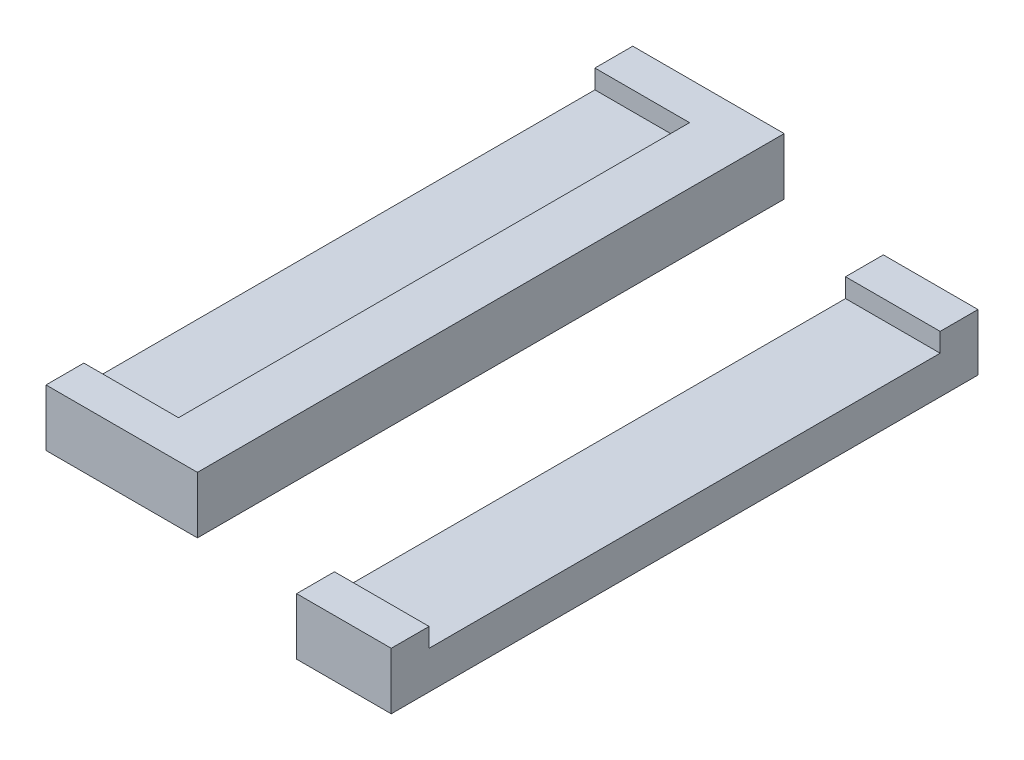
ISO-10303-21;
HEADER;
FILE_DESCRIPTION(('STEP AP214'),'2;1');
FILE_NAME('part.step','',(''),(''),'','','');
FILE_SCHEMA(('AUTOMOTIVE_DESIGN { 1 0 10303 214 1 1 1 1 }'));
ENDSEC;
DATA;
#1=APPLICATION_CONTEXT('core data for automotive mechanical design processes');
#2=APPLICATION_PROTOCOL_DEFINITION('international standard','automotive_design',2000,#1);
#3=PRODUCT_CONTEXT('',#1,'mechanical');
#4=PRODUCT('Part','Part','',(#3));
#5=PRODUCT_RELATED_PRODUCT_CATEGORY('part','',(#4));
#6=PRODUCT_DEFINITION_FORMATION('','',#4);
#7=PRODUCT_DEFINITION_CONTEXT('part definition',#1,'design');
#8=PRODUCT_DEFINITION('design','',#6,#7);
#9=PRODUCT_DEFINITION_SHAPE('','',#8);
#10=(LENGTH_UNIT() NAMED_UNIT(*) SI_UNIT(.MILLI.,.METRE.));
#11=(NAMED_UNIT(*) PLANE_ANGLE_UNIT() SI_UNIT($,.RADIAN.));
#12=(NAMED_UNIT(*) SI_UNIT($,.STERADIAN.) SOLID_ANGLE_UNIT());
#13=UNCERTAINTY_MEASURE_WITH_UNIT(LENGTH_MEASURE(1.E-05),#10,'distance_accuracy_value','');
#14=(GEOMETRIC_REPRESENTATION_CONTEXT(3) GLOBAL_UNCERTAINTY_ASSIGNED_CONTEXT((#13)) GLOBAL_UNIT_ASSIGNED_CONTEXT((#10,
#11,#12)) REPRESENTATION_CONTEXT('',''));
#15=CARTESIAN_POINT('',(0.,0.,0.));
#16=DIRECTION('',(0.,0.,1.));
#17=DIRECTION('',(1.,0.,0.));
#18=AXIS2_PLACEMENT_3D('',#15,#16,#17);
#19=CARTESIAN_POINT('',(0.,2.,0.));
#20=DIRECTION('',(0.,1.,0.));
#21=DIRECTION('',(0.,0.,1.));
#22=AXIS2_PLACEMENT_3D('',#19,#20,#21);
#23=PLANE('',#22);
#24=DIRECTION('',(0.,0.,1.));
#25=VECTOR('',#24,1.);
#26=CARTESIAN_POINT('',(3.94366197183099,2.,-2.28169014084507));
#27=LINE('',#26,#25);
#28=CARTESIAN_POINT('',(3.94366197183099,2.,-0.281690140845068));
#29=VERTEX_POINT('',#28);
#30=CARTESIAN_POINT('',(3.94366197183099,2.,26.7183098591549));
#31=VERTEX_POINT('',#30);
#32=EDGE_CURVE('E156',#29,#31,#27,.T.);
#33=ORIENTED_EDGE('',*,*,#32,.T.);
#34=DIRECTION('',(-1.,0.,0.));
#35=VECTOR('',#34,1.);
#36=CARTESIAN_POINT('',(3.94366197183099,2.,26.7183098591549));
#37=LINE('',#36,#35);
#38=CARTESIAN_POINT('',(8.943661971831,2.,26.7183098591549));
#39=VERTEX_POINT('',#38);
#40=EDGE_CURVE('E129',#39,#31,#37,.T.);
#41=ORIENTED_EDGE('',*,*,#40,.F.);
#42=DIRECTION('',(0.,0.,-1.));
#43=VECTOR('',#42,1.);
#44=CARTESIAN_POINT('',(8.94366197183099,2.,-2.28169014084507));
#45=LINE('',#44,#43);
#46=CARTESIAN_POINT('',(8.94366197183099,2.,-0.281690140845068));
#47=VERTEX_POINT('',#46);
#48=EDGE_CURVE('E158',#39,#47,#45,.T.);
#49=ORIENTED_EDGE('',*,*,#48,.T.);
#50=DIRECTION('',(1.,0.,0.));
#51=VECTOR('',#50,1.);
#52=CARTESIAN_POINT('',(3.94366197183099,2.,-0.281690140845068));
#53=LINE('',#52,#51);
#54=EDGE_CURVE('E66',#29,#47,#53,.T.);
#55=ORIENTED_EDGE('',*,*,#54,.F.);
#56=EDGE_LOOP('',(#33,#41,#49,#55));
#57=FACE_BOUND('',#56,.T.);
#58=ADVANCED_FACE('F43',(#57),#23,.T.);
#59=CARTESIAN_POINT('',(3.94366197183099,2.,-2.28169014084507));
#60=DIRECTION('',(1.,0.,0.));
#61=DIRECTION('',(0.,0.,-1.));
#62=AXIS2_PLACEMENT_3D('',#59,#60,#61);
#63=PLANE('',#62);
#64=DIRECTION('',(0.,0.,1.));
#65=VECTOR('',#64,1.);
#66=CARTESIAN_POINT('',(3.94366197183099,0.,-2.28169014084507));
#67=LINE('',#66,#65);
#68=CARTESIAN_POINT('',(3.94366197183099,0.,-2.28169014084507));
#69=VERTEX_POINT('',#68);
#70=CARTESIAN_POINT('',(3.943661971831,0.,28.7183098591549));
#71=VERTEX_POINT('',#70);
#72=EDGE_CURVE('E116',#69,#71,#67,.T.);
#73=ORIENTED_EDGE('',*,*,#72,.T.);
#74=DIRECTION('',(0.,-1.,0.));
#75=VECTOR('',#74,1.);
#76=CARTESIAN_POINT('',(3.943661971831,2.,28.7183098591549));
#77=LINE('',#76,#75);
#78=CARTESIAN_POINT('',(3.94366197183099,3.,28.7183098591549));
#79=VERTEX_POINT('',#78);
#80=EDGE_CURVE('E12',#79,#71,#77,.T.);
#81=ORIENTED_EDGE('',*,*,#80,.F.);
#82=DIRECTION('',(0.,0.,1.));
#83=VECTOR('',#82,1.);
#84=CARTESIAN_POINT('',(3.94366197183099,3.,26.7183098591549));
#85=LINE('',#84,#83);
#86=CARTESIAN_POINT('',(3.94366197183099,3.,26.7183098591549));
#87=VERTEX_POINT('',#86);
#88=EDGE_CURVE('E113',#87,#79,#85,.T.);
#89=ORIENTED_EDGE('',*,*,#88,.F.);
#90=DIRECTION('',(0.,-1.,0.));
#91=VECTOR('',#90,1.);
#92=CARTESIAN_POINT('',(3.94366197183099,3.,26.7183098591549));
#93=LINE('',#92,#91);
#94=EDGE_CURVE('E134',#87,#31,#93,.T.);
#95=ORIENTED_EDGE('',*,*,#94,.T.);
#96=ORIENTED_EDGE('',*,*,#32,.F.);
#97=DIRECTION('',(0.,-1.,0.));
#98=VECTOR('',#97,1.);
#99=CARTESIAN_POINT('',(3.94366197183099,3.,-0.281690140845068));
#100=LINE('',#99,#98);
#101=CARTESIAN_POINT('',(3.94366197183099,3.,-0.281690140845068));
#102=VERTEX_POINT('',#101);
#103=EDGE_CURVE('E153',#102,#29,#100,.T.);
#104=ORIENTED_EDGE('',*,*,#103,.F.);
#105=DIRECTION('',(0.,0.,1.));
#106=VECTOR('',#105,1.);
#107=CARTESIAN_POINT('',(3.94366197183099,3.,-2.28169014084507));
#108=LINE('',#107,#106);
#109=CARTESIAN_POINT('',(3.94366197183099,3.,-2.28169014084507));
#110=VERTEX_POINT('',#109);
#111=EDGE_CURVE('E138',#110,#102,#108,.T.);
#112=ORIENTED_EDGE('',*,*,#111,.F.);
#113=DIRECTION('',(0.,-1.,0.));
#114=VECTOR('',#113,1.);
#115=CARTESIAN_POINT('',(3.94366197183099,2.,-2.28169014084507));
#116=LINE('',#115,#114);
#117=EDGE_CURVE('E161',#110,#69,#116,.T.);
#118=ORIENTED_EDGE('',*,*,#117,.T.);
#119=EDGE_LOOP('',(#73,#81,#89,#95,#96,#104,#112,#118));
#120=FACE_BOUND('',#119,.T.);
#121=ADVANCED_FACE('F45',(#120),#63,.F.);
#122=CARTESIAN_POINT('',(3.943661971831,2.,28.7183098591549));
#123=DIRECTION('',(0.,0.,-1.));
#124=DIRECTION('',(-1.,0.,0.));
#125=AXIS2_PLACEMENT_3D('',#122,#123,#124);
#126=PLANE('',#125);
#127=DIRECTION('',(1.,0.,0.));
#128=VECTOR('',#127,1.);
#129=CARTESIAN_POINT('',(3.943661971831,0.,28.7183098591549));
#130=LINE('',#129,#128);
#131=CARTESIAN_POINT('',(8.943661971831,0.,28.7183098591549));
#132=VERTEX_POINT('',#131);
#133=EDGE_CURVE('E163',#71,#132,#130,.T.);
#134=ORIENTED_EDGE('',*,*,#133,.T.);
#135=DIRECTION('',(0.,-1.,0.));
#136=VECTOR('',#135,1.);
#137=CARTESIAN_POINT('',(8.943661971831,2.,28.7183098591549));
#138=LINE('',#137,#136);
#139=CARTESIAN_POINT('',(8.943661971831,3.,28.7183098591549));
#140=VERTEX_POINT('',#139);
#141=EDGE_CURVE('E51',#140,#132,#138,.T.);
#142=ORIENTED_EDGE('',*,*,#141,.F.);
#143=DIRECTION('',(1.,0.,0.));
#144=VECTOR('',#143,1.);
#145=CARTESIAN_POINT('',(3.94366197183099,3.,28.7183098591549));
#146=LINE('',#145,#144);
#147=EDGE_CURVE('E119',#79,#140,#146,.T.);
#148=ORIENTED_EDGE('',*,*,#147,.F.);
#149=ORIENTED_EDGE('',*,*,#80,.T.);
#150=EDGE_LOOP('',(#134,#142,#148,#149));
#151=FACE_BOUND('',#150,.T.);
#152=ADVANCED_FACE('F120',(#151),#126,.F.);
#153=CARTESIAN_POINT('',(8.94366197183099,2.,-2.28169014084507));
#154=DIRECTION('',(-1.,0.,0.));
#155=DIRECTION('',(0.,0.,1.));
#156=AXIS2_PLACEMENT_3D('',#153,#154,#155);
#157=PLANE('',#156);
#158=DIRECTION('',(0.,0.,-1.));
#159=VECTOR('',#158,1.);
#160=CARTESIAN_POINT('',(8.94366197183099,0.,-2.28169014084507));
#161=LINE('',#160,#159);
#162=CARTESIAN_POINT('',(8.94366197183099,0.,-2.28169014084507));
#163=VERTEX_POINT('',#162);
#164=EDGE_CURVE('E165',#132,#163,#161,.T.);
#165=ORIENTED_EDGE('',*,*,#164,.T.);
#166=DIRECTION('',(0.,-1.,0.));
#167=VECTOR('',#166,1.);
#168=CARTESIAN_POINT('',(8.94366197183099,2.,-2.28169014084507));
#169=LINE('',#168,#167);
#170=CARTESIAN_POINT('',(8.94366197183099,3.,-2.28169014084507));
#171=VERTEX_POINT('',#170);
#172=EDGE_CURVE('E169',#171,#163,#169,.T.);
#173=ORIENTED_EDGE('',*,*,#172,.F.);
#174=DIRECTION('',(0.,0.,-1.));
#175=VECTOR('',#174,1.);
#176=CARTESIAN_POINT('',(8.94366197183099,3.,-2.28169014084507));
#177=LINE('',#176,#175);
#178=CARTESIAN_POINT('',(8.94366197183099,3.,-0.281690140845068));
#179=VERTEX_POINT('',#178);
#180=EDGE_CURVE('E143',#179,#171,#177,.T.);
#181=ORIENTED_EDGE('',*,*,#180,.F.);
#182=DIRECTION('',(0.,-1.,0.));
#183=VECTOR('',#182,1.);
#184=CARTESIAN_POINT('',(8.94366197183099,3.,-0.281690140845068));
#185=LINE('',#184,#183);
#186=EDGE_CURVE('E149',#179,#47,#185,.T.);
#187=ORIENTED_EDGE('',*,*,#186,.T.);
#188=ORIENTED_EDGE('',*,*,#48,.F.);
#189=DIRECTION('',(0.,-1.,0.));
#190=VECTOR('',#189,1.);
#191=CARTESIAN_POINT('',(8.943661971831,3.,26.7183098591549));
#192=LINE('',#191,#190);
#193=CARTESIAN_POINT('',(8.943661971831,3.,26.7183098591549));
#194=VERTEX_POINT('',#193);
#195=EDGE_CURVE('E58',#194,#39,#192,.T.);
#196=ORIENTED_EDGE('',*,*,#195,.F.);
#197=DIRECTION('',(0.,0.,-1.));
#198=VECTOR('',#197,1.);
#199=CARTESIAN_POINT('',(8.943661971831,3.,26.7183098591549));
#200=LINE('',#199,#198);
#201=EDGE_CURVE('E124',#140,#194,#200,.T.);
#202=ORIENTED_EDGE('',*,*,#201,.F.);
#203=ORIENTED_EDGE('',*,*,#141,.T.);
#204=EDGE_LOOP('',(#165,#173,#181,#187,#188,#196,#202,#203));
#205=FACE_BOUND('',#204,.T.);
#206=ADVANCED_FACE('F173',(#205),#157,.F.);
#207=CARTESIAN_POINT('',(3.94366197183099,2.,-2.28169014084507));
#208=DIRECTION('',(0.,0.,1.));
#209=DIRECTION('',(1.,0.,0.));
#210=AXIS2_PLACEMENT_3D('',#207,#208,#209);
#211=PLANE('',#210);
#212=DIRECTION('',(-1.,0.,0.));
#213=VECTOR('',#212,1.);
#214=CARTESIAN_POINT('',(3.94366197183099,0.,-2.28169014084507));
#215=LINE('',#214,#213);
#216=EDGE_CURVE('E159',#163,#69,#215,.T.);
#217=ORIENTED_EDGE('',*,*,#216,.T.);
#218=ORIENTED_EDGE('',*,*,#117,.F.);
#219=DIRECTION('',(-1.,0.,0.));
#220=VECTOR('',#219,1.);
#221=CARTESIAN_POINT('',(3.94366197183099,3.,-2.28169014084507));
#222=LINE('',#221,#220);
#223=EDGE_CURVE('E146',#171,#110,#222,.T.);
#224=ORIENTED_EDGE('',*,*,#223,.F.);
#225=ORIENTED_EDGE('',*,*,#172,.T.);
#226=EDGE_LOOP('',(#217,#218,#224,#225));
#227=FACE_BOUND('',#226,.T.);
#228=ADVANCED_FACE('F178',(#227),#211,.F.);
#229=CARTESIAN_POINT('',(0.,0.,0.));
#230=DIRECTION('',(0.,1.,0.));
#231=DIRECTION('',(0.,0.,1.));
#232=AXIS2_PLACEMENT_3D('',#229,#230,#231);
#233=PLANE('',#232);
#234=ORIENTED_EDGE('',*,*,#72,.F.);
#235=ORIENTED_EDGE('',*,*,#216,.F.);
#236=ORIENTED_EDGE('',*,*,#164,.F.);
#237=ORIENTED_EDGE('',*,*,#133,.F.);
#238=EDGE_LOOP('',(#234,#235,#236,#237));
#239=FACE_BOUND('',#238,.T.);
#240=ADVANCED_FACE('F176',(#239),#233,.F.);
#241=CARTESIAN_POINT('',(3.94366197183099,3.,-0.281690140845068));
#242=DIRECTION('',(0.,0.,-1.));
#243=DIRECTION('',(-1.,0.,0.));
#244=AXIS2_PLACEMENT_3D('',#241,#242,#243);
#245=PLANE('',#244);
#246=ORIENTED_EDGE('',*,*,#54,.T.);
#247=ORIENTED_EDGE('',*,*,#186,.F.);
#248=DIRECTION('',(1.,0.,0.));
#249=VECTOR('',#248,1.);
#250=CARTESIAN_POINT('',(3.94366197183099,3.,-0.281690140845068));
#251=LINE('',#250,#249);
#252=EDGE_CURVE('E141',#102,#179,#251,.T.);
#253=ORIENTED_EDGE('',*,*,#252,.F.);
#254=ORIENTED_EDGE('',*,*,#103,.T.);
#255=EDGE_LOOP('',(#246,#247,#253,#254));
#256=FACE_BOUND('',#255,.T.);
#257=ADVANCED_FACE('F188',(#256),#245,.F.);
#258=CARTESIAN_POINT('',(0.,3.,0.));
#259=DIRECTION('',(0.,1.,0.));
#260=DIRECTION('',(0.,0.,1.));
#261=AXIS2_PLACEMENT_3D('',#258,#259,#260);
#262=PLANE('',#261);
#263=ORIENTED_EDGE('',*,*,#111,.T.);
#264=ORIENTED_EDGE('',*,*,#252,.T.);
#265=ORIENTED_EDGE('',*,*,#180,.T.);
#266=ORIENTED_EDGE('',*,*,#223,.T.);
#267=EDGE_LOOP('',(#263,#264,#265,#266));
#268=FACE_BOUND('',#267,.T.);
#269=ADVANCED_FACE('F183',(#268),#262,.T.);
#270=CARTESIAN_POINT('',(3.94366197183099,3.,26.7183098591549));
#271=DIRECTION('',(0.,0.,1.));
#272=DIRECTION('',(1.,0.,0.));
#273=AXIS2_PLACEMENT_3D('',#270,#271,#272);
#274=PLANE('',#273);
#275=ORIENTED_EDGE('',*,*,#40,.T.);
#276=ORIENTED_EDGE('',*,*,#94,.F.);
#277=DIRECTION('',(-1.,0.,0.));
#278=VECTOR('',#277,1.);
#279=CARTESIAN_POINT('',(3.94366197183099,3.,26.7183098591549));
#280=LINE('',#279,#278);
#281=EDGE_CURVE('E127',#194,#87,#280,.T.);
#282=ORIENTED_EDGE('',*,*,#281,.F.);
#283=ORIENTED_EDGE('',*,*,#195,.T.);
#284=EDGE_LOOP('',(#275,#276,#282,#283));
#285=FACE_BOUND('',#284,.T.);
#286=ADVANCED_FACE('F195',(#285),#274,.F.);
#287=CARTESIAN_POINT('',(0.,3.,0.));
#288=DIRECTION('',(0.,1.,0.));
#289=DIRECTION('',(0.,0.,1.));
#290=AXIS2_PLACEMENT_3D('',#287,#288,#289);
#291=PLANE('',#290);
#292=ORIENTED_EDGE('',*,*,#88,.T.);
#293=ORIENTED_EDGE('',*,*,#147,.T.);
#294=ORIENTED_EDGE('',*,*,#201,.T.);
#295=ORIENTED_EDGE('',*,*,#281,.T.);
#296=EDGE_LOOP('',(#292,#293,#294,#295));
#297=FACE_BOUND('',#296,.T.);
#298=ADVANCED_FACE('F126',(#297),#291,.T.);
#299=CLOSED_SHELL('',(#58,#121,#152,#206,#228,#240,#257,#269,#286,#298));
#300=MANIFOLD_SOLID_BREP('B2',#299);
#301=CARTESIAN_POINT('',(-12.2253521126761,2.,-5.2112676056338));
#302=DIRECTION('',(1.,0.,0.));
#303=DIRECTION('',(0.,0.,-1.));
#304=AXIS2_PLACEMENT_3D('',#301,#302,#303);
#305=PLANE('',#304);
#306=DIRECTION('',(0.,0.,1.));
#307=VECTOR('',#306,1.);
#308=CARTESIAN_POINT('',(-12.2253521126761,0.,-5.2112676056338));
#309=LINE('',#308,#307);
#310=CARTESIAN_POINT('',(-12.2253521126761,0.,-5.2112676056338));
#311=VERTEX_POINT('',#310);
#312=CARTESIAN_POINT('',(-12.225352112676,0.,25.7887323943662));
#313=VERTEX_POINT('',#312);
#314=EDGE_CURVE('E372',#311,#313,#309,.T.);
#315=ORIENTED_EDGE('',*,*,#314,.T.);
#316=DIRECTION('',(0.,-1.,0.));
#317=VECTOR('',#316,1.);
#318=CARTESIAN_POINT('',(-12.225352112676,2.,25.7887323943662));
#319=LINE('',#318,#317);
#320=CARTESIAN_POINT('',(-12.2253521126761,3.,25.7887323943662));
#321=VERTEX_POINT('',#320);
#322=EDGE_CURVE('E41',#321,#313,#319,.T.);
#323=ORIENTED_EDGE('',*,*,#322,.F.);
#324=DIRECTION('',(0.,0.,1.));
#325=VECTOR('',#324,1.);
#326=CARTESIAN_POINT('',(-12.2253521126761,3.,23.7887323943662));
#327=LINE('',#326,#325);
#328=CARTESIAN_POINT('',(-12.2253521126761,3.,23.7887323943662));
#329=VERTEX_POINT('',#328);
#330=EDGE_CURVE('E351',#329,#321,#327,.T.);
#331=ORIENTED_EDGE('',*,*,#330,.F.);
#332=DIRECTION('',(0.,-1.,0.));
#333=VECTOR('',#332,1.);
#334=CARTESIAN_POINT('',(-12.2253521126761,3.,23.7887323943662));
#335=LINE('',#334,#333);
#336=CARTESIAN_POINT('',(-12.225352112676,2.,23.7887323943662));
#337=VERTEX_POINT('',#336);
#338=EDGE_CURVE('E355',#329,#337,#335,.T.);
#339=ORIENTED_EDGE('',*,*,#338,.T.);
#340=DIRECTION('',(0.,0.,1.));
#341=VECTOR('',#340,1.);
#342=CARTESIAN_POINT('',(-12.2253521126761,2.,-5.2112676056338));
#343=LINE('',#342,#341);
#344=CARTESIAN_POINT('',(-12.2253521126761,2.,-3.2112676056338));
#345=VERTEX_POINT('',#344);
#346=EDGE_CURVE('E308',#345,#337,#343,.T.);
#347=ORIENTED_EDGE('',*,*,#346,.F.);
#348=DIRECTION('',(0.,-1.,0.));
#349=VECTOR('',#348,1.);
#350=CARTESIAN_POINT('',(-12.2253521126761,3.,-3.2112676056338));
#351=LINE('',#350,#349);
#352=CARTESIAN_POINT('',(-12.2253521126761,3.,-3.2112676056338));
#353=VERTEX_POINT('',#352);
#354=EDGE_CURVE('E373',#353,#345,#351,.T.);
#355=ORIENTED_EDGE('',*,*,#354,.F.);
#356=DIRECTION('',(0.,0.,1.));
#357=VECTOR('',#356,1.);
#358=CARTESIAN_POINT('',(-12.2253521126761,3.,-5.2112676056338));
#359=LINE('',#358,#357);
#360=CARTESIAN_POINT('',(-12.2253521126761,3.,-5.2112676056338));
#361=VERTEX_POINT('',#360);
#362=EDGE_CURVE('E411',#361,#353,#359,.T.);
#363=ORIENTED_EDGE('',*,*,#362,.F.);
#364=DIRECTION('',(0.,-1.,0.));
#365=VECTOR('',#364,1.);
#366=CARTESIAN_POINT('',(-12.2253521126761,2.,-5.2112676056338));
#367=LINE('',#366,#365);
#368=EDGE_CURVE('E382',#361,#311,#367,.T.);
#369=ORIENTED_EDGE('',*,*,#368,.T.);
#370=EDGE_LOOP('',(#315,#323,#331,#339,#347,#355,#363,#369));
#371=FACE_BOUND('',#370,.T.);
#372=ADVANCED_FACE('F289',(#371),#305,.F.);
#373=CARTESIAN_POINT('',(-12.225352112676,2.,25.7887323943662));
#374=DIRECTION('',(0.,0.,-1.));
#375=DIRECTION('',(-1.,0.,0.));
#376=AXIS2_PLACEMENT_3D('',#373,#374,#375);
#377=PLANE('',#376);
#378=DIRECTION('',(1.,0.,0.));
#379=VECTOR('',#378,1.);
#380=CARTESIAN_POINT('',(-12.225352112676,0.,25.7887323943662));
#381=LINE('',#380,#379);
#382=CARTESIAN_POINT('',(-4.22535211267605,0.,25.7887323943662));
#383=VERTEX_POINT('',#382);
#384=EDGE_CURVE('E375',#313,#383,#381,.T.);
#385=ORIENTED_EDGE('',*,*,#384,.T.);
#386=DIRECTION('',(0.,-1.,0.));
#387=VECTOR('',#386,1.);
#388=CARTESIAN_POINT('',(-4.22535211267605,2.,25.7887323943662));
#389=LINE('',#388,#387);
#390=CARTESIAN_POINT('',(-4.22535211267605,3.,25.7887323943662));
#391=VERTEX_POINT('',#390);
#392=EDGE_CURVE('E296',#391,#383,#389,.T.);
#393=ORIENTED_EDGE('',*,*,#392,.F.);
#394=DIRECTION('',(1.,0.,0.));
#395=VECTOR('',#394,1.);
#396=CARTESIAN_POINT('',(-12.2253521126761,3.,25.7887323943662));
#397=LINE('',#396,#395);
#398=EDGE_CURVE('E359',#321,#391,#397,.T.);
#399=ORIENTED_EDGE('',*,*,#398,.F.);
#400=ORIENTED_EDGE('',*,*,#322,.T.);
#401=EDGE_LOOP('',(#385,#393,#399,#400));
#402=FACE_BOUND('',#401,.T.);
#403=ADVANCED_FACE('F446',(#402),#377,.F.);
#404=CARTESIAN_POINT('',(-4.22535211267605,2.,-5.2112676056338));
#405=DIRECTION('',(-1.,0.,0.));
#406=DIRECTION('',(0.,0.,1.));
#407=AXIS2_PLACEMENT_3D('',#404,#405,#406);
#408=PLANE('',#407);
#409=DIRECTION('',(0.,0.,-1.));
#410=VECTOR('',#409,1.);
#411=CARTESIAN_POINT('',(-4.22535211267605,0.,-5.2112676056338));
#412=LINE('',#411,#410);
#413=CARTESIAN_POINT('',(-4.22535211267605,0.,-5.2112676056338));
#414=VERTEX_POINT('',#413);
#415=EDGE_CURVE('E386',#383,#414,#412,.T.);
#416=ORIENTED_EDGE('',*,*,#415,.T.);
#417=DIRECTION('',(0.,-1.,0.));
#418=VECTOR('',#417,1.);
#419=CARTESIAN_POINT('',(-4.22535211267605,2.,-5.2112676056338));
#420=LINE('',#419,#418);
#421=CARTESIAN_POINT('',(-4.22535211267605,3.,-5.2112676056338));
#422=VERTEX_POINT('',#421);
#423=EDGE_CURVE('E391',#422,#414,#420,.T.);
#424=ORIENTED_EDGE('',*,*,#423,.F.);
#425=DIRECTION('',(0.,0.,-1.));
#426=VECTOR('',#425,1.);
#427=CARTESIAN_POINT('',(-4.22535211267605,3.,23.7887323943662));
#428=LINE('',#427,#426);
#429=EDGE_CURVE('E399',#391,#422,#428,.T.);
#430=ORIENTED_EDGE('',*,*,#429,.F.);
#431=ORIENTED_EDGE('',*,*,#392,.T.);
#432=EDGE_LOOP('',(#416,#424,#430,#431));
#433=FACE_BOUND('',#432,.T.);
#434=ADVANCED_FACE('F397',(#433),#408,.F.);
#435=CARTESIAN_POINT('',(-12.2253521126761,2.,-5.2112676056338));
#436=DIRECTION('',(0.,0.,1.));
#437=DIRECTION('',(1.,0.,0.));
#438=AXIS2_PLACEMENT_3D('',#435,#436,#437);
#439=PLANE('',#438);
#440=DIRECTION('',(-1.,0.,0.));
#441=VECTOR('',#440,1.);
#442=CARTESIAN_POINT('',(-12.2253521126761,0.,-5.2112676056338));
#443=LINE('',#442,#441);
#444=EDGE_CURVE('E383',#414,#311,#443,.T.);
#445=ORIENTED_EDGE('',*,*,#444,.T.);
#446=ORIENTED_EDGE('',*,*,#368,.F.);
#447=DIRECTION('',(-1.,0.,0.));
#448=VECTOR('',#447,1.);
#449=CARTESIAN_POINT('',(-12.2253521126761,3.,-5.2112676056338));
#450=LINE('',#449,#448);
#451=EDGE_CURVE('E414',#422,#361,#450,.T.);
#452=ORIENTED_EDGE('',*,*,#451,.F.);
#453=ORIENTED_EDGE('',*,*,#423,.T.);
#454=EDGE_LOOP('',(#445,#446,#452,#453));
#455=FACE_BOUND('',#454,.T.);
#456=ADVANCED_FACE('F406',(#455),#439,.F.);
#457=CARTESIAN_POINT('',(0.,2.,0.));
#458=DIRECTION('',(0.,1.,0.));
#459=DIRECTION('',(0.,0.,1.));
#460=AXIS2_PLACEMENT_3D('',#457,#458,#459);
#461=PLANE('',#460);
#462=DIRECTION('',(-1.,0.,0.));
#463=VECTOR('',#462,1.);
#464=CARTESIAN_POINT('',(-7.22535211267604,2.,23.7887323943662));
#465=LINE('',#464,#463);
#466=CARTESIAN_POINT('',(-7.22535211267604,2.,23.7887323943662));
#467=VERTEX_POINT('',#466);
#468=EDGE_CURVE('E303',#467,#337,#465,.T.);
#469=ORIENTED_EDGE('',*,*,#468,.F.);
#470=DIRECTION('',(0.,0.,1.));
#471=VECTOR('',#470,1.);
#472=CARTESIAN_POINT('',(-7.22535211267605,2.,-3.2112676056338));
#473=LINE('',#472,#471);
#474=CARTESIAN_POINT('',(-7.22535211267605,2.,-3.2112676056338));
#475=VERTEX_POINT('',#474);
#476=EDGE_CURVE('E369',#475,#467,#473,.T.);
#477=ORIENTED_EDGE('',*,*,#476,.F.);
#478=DIRECTION('',(1.,0.,0.));
#479=VECTOR('',#478,1.);
#480=CARTESIAN_POINT('',(-12.2253521126761,2.,-3.2112676056338));
#481=LINE('',#480,#479);
#482=EDGE_CURVE('E423',#345,#475,#481,.T.);
#483=ORIENTED_EDGE('',*,*,#482,.F.);
#484=ORIENTED_EDGE('',*,*,#346,.T.);
#485=EDGE_LOOP('',(#469,#477,#483,#484));
#486=FACE_BOUND('',#485,.T.);
#487=ADVANCED_FACE('F433',(#486),#461,.T.);
#488=CARTESIAN_POINT('',(0.,0.,0.));
#489=DIRECTION('',(0.,1.,0.));
#490=DIRECTION('',(0.,0.,1.));
#491=AXIS2_PLACEMENT_3D('',#488,#489,#490);
#492=PLANE('',#491);
#493=ORIENTED_EDGE('',*,*,#314,.F.);
#494=ORIENTED_EDGE('',*,*,#444,.F.);
#495=ORIENTED_EDGE('',*,*,#415,.F.);
#496=ORIENTED_EDGE('',*,*,#384,.F.);
#497=EDGE_LOOP('',(#493,#494,#495,#496));
#498=FACE_BOUND('',#497,.T.);
#499=ADVANCED_FACE('F404',(#498),#492,.F.);
#500=CARTESIAN_POINT('',(-7.22535211267604,3.,23.7887323943662));
#501=DIRECTION('',(0.,0.,1.));
#502=DIRECTION('',(1.,0.,0.));
#503=AXIS2_PLACEMENT_3D('',#500,#501,#502);
#504=PLANE('',#503);
#505=ORIENTED_EDGE('',*,*,#468,.T.);
#506=ORIENTED_EDGE('',*,*,#338,.F.);
#507=DIRECTION('',(-1.,0.,0.));
#508=VECTOR('',#507,1.);
#509=CARTESIAN_POINT('',(-7.22535211267604,3.,23.7887323943662));
#510=LINE('',#509,#508);
#511=CARTESIAN_POINT('',(-7.22535211267604,3.,23.7887323943662));
#512=VERTEX_POINT('',#511);
#513=EDGE_CURVE('E360',#512,#329,#510,.T.);
#514=ORIENTED_EDGE('',*,*,#513,.F.);
#515=DIRECTION('',(0.,-1.,0.));
#516=VECTOR('',#515,1.);
#517=CARTESIAN_POINT('',(-7.22535211267604,3.,23.7887323943662));
#518=LINE('',#517,#516);
#519=EDGE_CURVE('E421',#512,#467,#518,.T.);
#520=ORIENTED_EDGE('',*,*,#519,.T.);
#521=EDGE_LOOP('',(#505,#506,#514,#520));
#522=FACE_BOUND('',#521,.T.);
#523=ADVANCED_FACE('F371',(#522),#504,.F.);
#524=CARTESIAN_POINT('',(-12.2253521126761,3.,-3.2112676056338));
#525=DIRECTION('',(0.,0.,-1.));
#526=DIRECTION('',(-1.,0.,0.));
#527=AXIS2_PLACEMENT_3D('',#524,#525,#526);
#528=PLANE('',#527);
#529=ORIENTED_EDGE('',*,*,#482,.T.);
#530=DIRECTION('',(0.,-1.,0.));
#531=VECTOR('',#530,1.);
#532=CARTESIAN_POINT('',(-7.22535211267605,3.,-3.2112676056338));
#533=LINE('',#532,#531);
#534=CARTESIAN_POINT('',(-7.22535211267605,3.,-3.2112676056338));
#535=VERTEX_POINT('',#534);
#536=EDGE_CURVE('E378',#535,#475,#533,.T.);
#537=ORIENTED_EDGE('',*,*,#536,.F.);
#538=DIRECTION('',(1.,0.,0.));
#539=VECTOR('',#538,1.);
#540=CARTESIAN_POINT('',(-12.2253521126761,3.,-3.2112676056338));
#541=LINE('',#540,#539);
#542=EDGE_CURVE('E413',#353,#535,#541,.T.);
#543=ORIENTED_EDGE('',*,*,#542,.F.);
#544=ORIENTED_EDGE('',*,*,#354,.T.);
#545=EDGE_LOOP('',(#529,#537,#543,#544));
#546=FACE_BOUND('',#545,.T.);
#547=ADVANCED_FACE('F432',(#546),#528,.F.);
#548=CARTESIAN_POINT('',(-7.22535211267605,3.,-3.2112676056338));
#549=DIRECTION('',(1.,0.,0.));
#550=DIRECTION('',(0.,0.,-1.));
#551=AXIS2_PLACEMENT_3D('',#548,#549,#550);
#552=PLANE('',#551);
#553=ORIENTED_EDGE('',*,*,#476,.T.);
#554=ORIENTED_EDGE('',*,*,#519,.F.);
#555=DIRECTION('',(0.,0.,1.));
#556=VECTOR('',#555,1.);
#557=CARTESIAN_POINT('',(-7.22535211267605,3.,-3.2112676056338));
#558=LINE('',#557,#556);
#559=EDGE_CURVE('E365',#535,#512,#558,.T.);
#560=ORIENTED_EDGE('',*,*,#559,.F.);
#561=ORIENTED_EDGE('',*,*,#536,.T.);
#562=EDGE_LOOP('',(#553,#554,#560,#561));
#563=FACE_BOUND('',#562,.T.);
#564=ADVANCED_FACE('F430',(#563),#552,.F.);
#565=CARTESIAN_POINT('',(0.,3.,0.));
#566=DIRECTION('',(0.,1.,0.));
#567=DIRECTION('',(0.,0.,1.));
#568=AXIS2_PLACEMENT_3D('',#565,#566,#567);
#569=PLANE('',#568);
#570=ORIENTED_EDGE('',*,*,#513,.T.);
#571=ORIENTED_EDGE('',*,*,#330,.T.);
#572=ORIENTED_EDGE('',*,*,#398,.T.);
#573=ORIENTED_EDGE('',*,*,#429,.T.);
#574=ORIENTED_EDGE('',*,*,#451,.T.);
#575=ORIENTED_EDGE('',*,*,#362,.T.);
#576=ORIENTED_EDGE('',*,*,#542,.T.);
#577=ORIENTED_EDGE('',*,*,#559,.T.);
#578=EDGE_LOOP('',(#570,#571,#572,#573,#574,#575,#576,#577));
#579=FACE_BOUND('',#578,.T.);
#580=ADVANCED_FACE('F363',(#579),#569,.T.);
#581=CLOSED_SHELL('',(#372,#403,#434,#456,#487,#499,#523,#547,#564,#580));
#582=MANIFOLD_SOLID_BREP('B6',#581);
#583=ADVANCED_BREP_SHAPE_REPRESENTATION('',(#18,#300,#582),#14);
#584=SHAPE_DEFINITION_REPRESENTATION(#9,#583);
ENDSEC;
END-ISO-10303-21;
